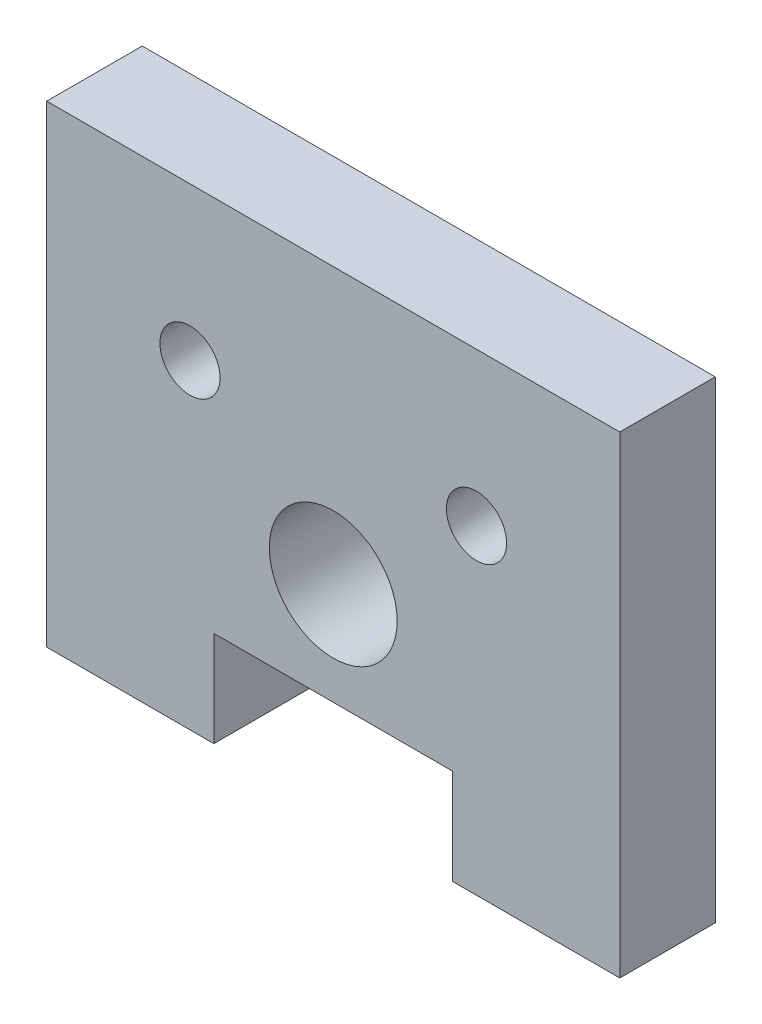
ISO-10303-21;
HEADER;
FILE_DESCRIPTION(('STEP AP214'),'2;1');
FILE_NAME('part.step','',(''),(''),'','','');
FILE_SCHEMA(('AUTOMOTIVE_DESIGN { 1 0 10303 214 1 1 1 1 }'));
ENDSEC;
DATA;
#1=APPLICATION_CONTEXT('core data for automotive mechanical design processes');
#2=APPLICATION_PROTOCOL_DEFINITION('international standard','automotive_design',2000,#1);
#3=PRODUCT_CONTEXT('',#1,'mechanical');
#4=PRODUCT('Part','Part','',(#3));
#5=PRODUCT_RELATED_PRODUCT_CATEGORY('part','',(#4));
#6=PRODUCT_DEFINITION_FORMATION('','',#4);
#7=PRODUCT_DEFINITION_CONTEXT('part definition',#1,'design');
#8=PRODUCT_DEFINITION('design','',#6,#7);
#9=PRODUCT_DEFINITION_SHAPE('','',#8);
#10=(LENGTH_UNIT() NAMED_UNIT(*) SI_UNIT(.MILLI.,.METRE.));
#11=(NAMED_UNIT(*) PLANE_ANGLE_UNIT() SI_UNIT($,.RADIAN.));
#12=(NAMED_UNIT(*) SI_UNIT($,.STERADIAN.) SOLID_ANGLE_UNIT());
#13=UNCERTAINTY_MEASURE_WITH_UNIT(LENGTH_MEASURE(1.E-05),#10,'distance_accuracy_value','');
#14=(GEOMETRIC_REPRESENTATION_CONTEXT(3) GLOBAL_UNCERTAINTY_ASSIGNED_CONTEXT((#13)) GLOBAL_UNIT_ASSIGNED_CONTEXT((#10,
#11,#12)) REPRESENTATION_CONTEXT('',''));
#15=CARTESIAN_POINT('',(0.,0.,0.));
#16=DIRECTION('',(0.,0.,1.));
#17=DIRECTION('',(1.,0.,0.));
#18=AXIS2_PLACEMENT_3D('',#15,#16,#17);
#19=CARTESIAN_POINT('',(-15.875,0.,12.7));
#20=DIRECTION('',(-1.,0.,0.));
#21=DIRECTION('',(0.,0.,1.));
#22=AXIS2_PLACEMENT_3D('',#19,#20,#21);
#23=PLANE('',#22);
#24=DIRECTION('',(0.,1.,0.));
#25=VECTOR('',#24,1.);
#26=CARTESIAN_POINT('',(-15.875,0.,0.));
#27=LINE('',#26,#25);
#28=CARTESIAN_POINT('',(-15.875,-34.544,0.));
#29=VERTEX_POINT('',#28);
#30=CARTESIAN_POINT('',(-15.875,-21.844,0.));
#31=VERTEX_POINT('',#30);
#32=EDGE_CURVE('E139',#29,#31,#27,.T.);
#33=ORIENTED_EDGE('',*,*,#32,.T.);
#34=DIRECTION('',(0.,0.,-1.));
#35=VECTOR('',#34,1.);
#36=CARTESIAN_POINT('',(-15.875,-21.844,12.7));
#37=LINE('',#36,#35);
#38=CARTESIAN_POINT('',(-15.875,-21.844,12.7));
#39=VERTEX_POINT('',#38);
#40=EDGE_CURVE('E11',#39,#31,#37,.T.);
#41=ORIENTED_EDGE('',*,*,#40,.F.);
#42=DIRECTION('',(0.,1.,0.));
#43=VECTOR('',#42,1.);
#44=CARTESIAN_POINT('',(-15.875,0.,12.7));
#45=LINE('',#44,#43);
#46=CARTESIAN_POINT('',(-15.875,-34.544,12.7));
#47=VERTEX_POINT('',#46);
#48=EDGE_CURVE('E184',#47,#39,#45,.T.);
#49=ORIENTED_EDGE('',*,*,#48,.F.);
#50=DIRECTION('',(0.,0.,-1.));
#51=VECTOR('',#50,1.);
#52=CARTESIAN_POINT('',(-15.875,-34.544,12.7));
#53=LINE('',#52,#51);
#54=EDGE_CURVE('E49',#47,#29,#53,.T.);
#55=ORIENTED_EDGE('',*,*,#54,.T.);
#56=EDGE_LOOP('',(#33,#41,#49,#55));
#57=FACE_BOUND('',#56,.T.);
#58=ADVANCED_FACE('F32',(#57),#23,.F.);
#59=CARTESIAN_POINT('',(0.,-21.844,12.7));
#60=DIRECTION('',(0.,1.,0.));
#61=DIRECTION('',(-1.,0.,0.));
#62=AXIS2_PLACEMENT_3D('',#59,#60,#61);
#63=PLANE('',#62);
#64=DIRECTION('',(1.,0.,0.));
#65=VECTOR('',#64,1.);
#66=CARTESIAN_POINT('',(0.,-21.844,0.));
#67=LINE('',#66,#65);
#68=CARTESIAN_POINT('',(15.875,-21.844,0.));
#69=VERTEX_POINT('',#68);
#70=EDGE_CURVE('E141',#31,#69,#67,.T.);
#71=ORIENTED_EDGE('',*,*,#70,.T.);
#72=DIRECTION('',(0.,0.,-1.));
#73=VECTOR('',#72,1.);
#74=CARTESIAN_POINT('',(15.875,-21.844,12.7));
#75=LINE('',#74,#73);
#76=CARTESIAN_POINT('',(15.875,-21.844,12.7));
#77=VERTEX_POINT('',#76);
#78=EDGE_CURVE('E41',#77,#69,#75,.T.);
#79=ORIENTED_EDGE('',*,*,#78,.F.);
#80=DIRECTION('',(1.,0.,0.));
#81=VECTOR('',#80,1.);
#82=CARTESIAN_POINT('',(0.,-21.844,12.7));
#83=LINE('',#82,#81);
#84=EDGE_CURVE('E87',#39,#77,#83,.T.);
#85=ORIENTED_EDGE('',*,*,#84,.F.);
#86=ORIENTED_EDGE('',*,*,#40,.T.);
#87=EDGE_LOOP('',(#71,#79,#85,#86));
#88=FACE_BOUND('',#87,.T.);
#89=ADVANCED_FACE('F220',(#88),#63,.F.);
#90=CARTESIAN_POINT('',(15.875,0.,12.7));
#91=DIRECTION('',(1.,0.,0.));
#92=DIRECTION('',(0.,0.,-1.));
#93=AXIS2_PLACEMENT_3D('',#90,#91,#92);
#94=PLANE('',#93);
#95=DIRECTION('',(0.,-1.,0.));
#96=VECTOR('',#95,1.);
#97=CARTESIAN_POINT('',(15.875,0.,0.));
#98=LINE('',#97,#96);
#99=CARTESIAN_POINT('',(15.875,-34.544,0.));
#100=VERTEX_POINT('',#99);
#101=EDGE_CURVE('E143',#69,#100,#98,.T.);
#102=ORIENTED_EDGE('',*,*,#101,.T.);
#103=DIRECTION('',(0.,0.,-1.));
#104=VECTOR('',#103,1.);
#105=CARTESIAN_POINT('',(15.875,-34.544,12.7));
#106=LINE('',#105,#104);
#107=CARTESIAN_POINT('',(15.875,-34.544,12.7));
#108=VERTEX_POINT('',#107);
#109=EDGE_CURVE('E164',#108,#100,#106,.T.);
#110=ORIENTED_EDGE('',*,*,#109,.F.);
#111=DIRECTION('',(0.,-1.,0.));
#112=VECTOR('',#111,1.);
#113=CARTESIAN_POINT('',(15.875,0.,12.7));
#114=LINE('',#113,#112);
#115=EDGE_CURVE('E171',#77,#108,#114,.T.);
#116=ORIENTED_EDGE('',*,*,#115,.F.);
#117=ORIENTED_EDGE('',*,*,#78,.T.);
#118=EDGE_LOOP('',(#102,#110,#116,#117));
#119=FACE_BOUND('',#118,.T.);
#120=ADVANCED_FACE('F169',(#119),#94,.F.);
#121=CARTESIAN_POINT('',(0.,-34.544,12.7));
#122=DIRECTION('',(0.,-1.,0.));
#123=DIRECTION('',(0.,0.,-1.));
#124=AXIS2_PLACEMENT_3D('',#121,#122,#123);
#125=PLANE('',#124);
#126=DIRECTION('',(-1.,0.,0.));
#127=VECTOR('',#126,1.);
#128=CARTESIAN_POINT('',(0.,-34.544,0.));
#129=LINE('',#128,#127);
#130=CARTESIAN_POINT('',(38.1,-34.544,0.));
#131=VERTEX_POINT('',#130);
#132=EDGE_CURVE('E146',#131,#100,#129,.T.);
#133=ORIENTED_EDGE('',*,*,#132,.F.);
#134=DIRECTION('',(0.,0.,-1.));
#135=VECTOR('',#134,1.);
#136=CARTESIAN_POINT('',(38.1,-34.544,12.7));
#137=LINE('',#136,#135);
#138=CARTESIAN_POINT('',(38.1,-34.544,12.7));
#139=VERTEX_POINT('',#138);
#140=EDGE_CURVE('E162',#139,#131,#137,.T.);
#141=ORIENTED_EDGE('',*,*,#140,.F.);
#142=DIRECTION('',(-1.,0.,0.));
#143=VECTOR('',#142,1.);
#144=CARTESIAN_POINT('',(0.,-34.544,12.7));
#145=LINE('',#144,#143);
#146=EDGE_CURVE('E179',#139,#108,#145,.T.);
#147=ORIENTED_EDGE('',*,*,#146,.T.);
#148=ORIENTED_EDGE('',*,*,#109,.T.);
#149=EDGE_LOOP('',(#133,#141,#147,#148));
#150=FACE_BOUND('',#149,.T.);
#151=ADVANCED_FACE('F177',(#150),#125,.T.);
#152=CARTESIAN_POINT('',(38.1,0.,12.7));
#153=DIRECTION('',(-1.,0.,0.));
#154=DIRECTION('',(0.,0.,1.));
#155=AXIS2_PLACEMENT_3D('',#152,#153,#154);
#156=PLANE('',#155);
#157=DIRECTION('',(0.,1.,0.));
#158=VECTOR('',#157,1.);
#159=CARTESIAN_POINT('',(38.1,0.,0.));
#160=LINE('',#159,#158);
#161=CARTESIAN_POINT('',(38.1,28.3363680824292,0.));
#162=VERTEX_POINT('',#161);
#163=EDGE_CURVE('E149',#131,#162,#160,.T.);
#164=ORIENTED_EDGE('',*,*,#163,.T.);
#165=DIRECTION('',(0.,0.,-1.));
#166=VECTOR('',#165,1.);
#167=CARTESIAN_POINT('',(38.1,28.3363680824292,12.7));
#168=LINE('',#167,#166);
#169=CARTESIAN_POINT('',(38.1,28.3363680824292,12.7));
#170=VERTEX_POINT('',#169);
#171=EDGE_CURVE('E112',#170,#162,#168,.T.);
#172=ORIENTED_EDGE('',*,*,#171,.F.);
#173=DIRECTION('',(0.,1.,0.));
#174=VECTOR('',#173,1.);
#175=CARTESIAN_POINT('',(38.1,0.,12.7));
#176=LINE('',#175,#174);
#177=EDGE_CURVE('E121',#139,#170,#176,.T.);
#178=ORIENTED_EDGE('',*,*,#177,.F.);
#179=ORIENTED_EDGE('',*,*,#140,.T.);
#180=EDGE_LOOP('',(#164,#172,#178,#179));
#181=FACE_BOUND('',#180,.T.);
#182=ADVANCED_FACE('F244',(#181),#156,.F.);
#183=CARTESIAN_POINT('',(0.,28.3363680824292,12.7));
#184=DIRECTION('',(0.,1.,0.));
#185=DIRECTION('',(-1.,0.,0.));
#186=AXIS2_PLACEMENT_3D('',#183,#184,#185);
#187=PLANE('',#186);
#188=DIRECTION('',(1.,0.,0.));
#189=VECTOR('',#188,1.);
#190=CARTESIAN_POINT('',(0.,28.3363680824292,0.));
#191=LINE('',#190,#189);
#192=CARTESIAN_POINT('',(-38.1,28.3363680824292,0.));
#193=VERTEX_POINT('',#192);
#194=EDGE_CURVE('E108',#193,#162,#191,.T.);
#195=ORIENTED_EDGE('',*,*,#194,.F.);
#196=DIRECTION('',(0.,0.,-1.));
#197=VECTOR('',#196,1.);
#198=CARTESIAN_POINT('',(-38.1,28.3363680824292,12.7));
#199=LINE('',#198,#197);
#200=CARTESIAN_POINT('',(-38.1,28.3363680824292,12.7));
#201=VERTEX_POINT('',#200);
#202=EDGE_CURVE('E103',#201,#193,#199,.T.);
#203=ORIENTED_EDGE('',*,*,#202,.F.);
#204=DIRECTION('',(1.,0.,0.));
#205=VECTOR('',#204,1.);
#206=CARTESIAN_POINT('',(0.,28.3363680824292,12.7));
#207=LINE('',#206,#205);
#208=EDGE_CURVE('E106',#201,#170,#207,.T.);
#209=ORIENTED_EDGE('',*,*,#208,.T.);
#210=ORIENTED_EDGE('',*,*,#171,.T.);
#211=EDGE_LOOP('',(#195,#203,#209,#210));
#212=FACE_BOUND('',#211,.T.);
#213=ADVANCED_FACE('F105',(#212),#187,.T.);
#214=CARTESIAN_POINT('',(-38.1,0.,12.7));
#215=DIRECTION('',(-1.,0.,0.));
#216=DIRECTION('',(0.,0.,1.));
#217=AXIS2_PLACEMENT_3D('',#214,#215,#216);
#218=PLANE('',#217);
#219=DIRECTION('',(0.,1.,0.));
#220=VECTOR('',#219,1.);
#221=CARTESIAN_POINT('',(-38.1,0.,0.));
#222=LINE('',#221,#220);
#223=CARTESIAN_POINT('',(-38.1,-34.544,0.));
#224=VERTEX_POINT('',#223);
#225=EDGE_CURVE('E153',#224,#193,#222,.T.);
#226=ORIENTED_EDGE('',*,*,#225,.F.);
#227=DIRECTION('',(0.,0.,-1.));
#228=VECTOR('',#227,1.);
#229=CARTESIAN_POINT('',(-38.1,-34.544,12.7));
#230=LINE('',#229,#228);
#231=CARTESIAN_POINT('',(-38.1,-34.544,12.7));
#232=VERTEX_POINT('',#231);
#233=EDGE_CURVE('E75',#232,#224,#230,.T.);
#234=ORIENTED_EDGE('',*,*,#233,.F.);
#235=DIRECTION('',(0.,1.,0.));
#236=VECTOR('',#235,1.);
#237=CARTESIAN_POINT('',(-38.1,0.,12.7));
#238=LINE('',#237,#236);
#239=EDGE_CURVE('E118',#232,#201,#238,.T.);
#240=ORIENTED_EDGE('',*,*,#239,.T.);
#241=ORIENTED_EDGE('',*,*,#202,.T.);
#242=EDGE_LOOP('',(#226,#234,#240,#241));
#243=FACE_BOUND('',#242,.T.);
#244=ADVANCED_FACE('F124',(#243),#218,.T.);
#245=CARTESIAN_POINT('',(-19.05,7.99200000000001,12.7));
#246=DIRECTION('',(0.,0.,-1.));
#247=DIRECTION('',(-1.,0.,0.));
#248=AXIS2_PLACEMENT_3D('',#245,#246,#247);
#249=CYLINDRICAL_SURFACE('',#248,4.);
#250=CARTESIAN_POINT('',(-19.05,7.99200000000001,12.7));
#251=DIRECTION('',(0.,0.,1.));
#252=DIRECTION('',(1.,0.,0.));
#253=AXIS2_PLACEMENT_3D('',#250,#251,#252);
#254=CIRCLE('',#253,4.);
#255=CARTESIAN_POINT('',(-15.05,7.99200000000001,12.7));
#256=VERTEX_POINT('',#255);
#257=EDGE_CURVE('E186',#256,#256,#254,.T.);
#258=ORIENTED_EDGE('',*,*,#257,.T.);
#259=EDGE_LOOP('',(#258));
#260=FACE_BOUND('',#259,.T.);
#261=CARTESIAN_POINT('',(-19.05,7.99200000000001,0.));
#262=DIRECTION('',(0.,0.,1.));
#263=DIRECTION('',(1.,0.,0.));
#264=AXIS2_PLACEMENT_3D('',#261,#262,#263);
#265=CIRCLE('',#264,4.);
#266=CARTESIAN_POINT('',(-15.05,7.99200000000001,0.));
#267=VERTEX_POINT('',#266);
#268=EDGE_CURVE('E136',#267,#267,#265,.T.);
#269=ORIENTED_EDGE('',*,*,#268,.F.);
#270=EDGE_LOOP('',(#269));
#271=FACE_BOUND('',#270,.T.);
#272=ADVANCED_FACE('F205',(#260,#271),#249,.F.);
#273=CARTESIAN_POINT('',(19.05,7.99200000000001,12.7));
#274=DIRECTION('',(0.,0.,-1.));
#275=DIRECTION('',(-1.,0.,0.));
#276=AXIS2_PLACEMENT_3D('',#273,#274,#275);
#277=CYLINDRICAL_SURFACE('',#276,4.);
#278=CARTESIAN_POINT('',(19.05,7.99200000000001,12.7));
#279=DIRECTION('',(0.,0.,1.));
#280=DIRECTION('',(1.,0.,0.));
#281=AXIS2_PLACEMENT_3D('',#278,#279,#280);
#282=CIRCLE('',#281,4.);
#283=CARTESIAN_POINT('',(23.05,7.99200000000001,12.7));
#284=VERTEX_POINT('',#283);
#285=EDGE_CURVE('E189',#284,#284,#282,.T.);
#286=ORIENTED_EDGE('',*,*,#285,.T.);
#287=EDGE_LOOP('',(#286));
#288=FACE_BOUND('',#287,.T.);
#289=CARTESIAN_POINT('',(19.05,7.99200000000001,0.));
#290=DIRECTION('',(0.,0.,1.));
#291=DIRECTION('',(1.,0.,0.));
#292=AXIS2_PLACEMENT_3D('',#289,#290,#291);
#293=CIRCLE('',#292,4.);
#294=CARTESIAN_POINT('',(23.05,7.99200000000001,0.));
#295=VERTEX_POINT('',#294);
#296=EDGE_CURVE('E133',#295,#295,#293,.T.);
#297=ORIENTED_EDGE('',*,*,#296,.F.);
#298=EDGE_LOOP('',(#297));
#299=FACE_BOUND('',#298,.T.);
#300=ADVANCED_FACE('F208',(#288,#299),#277,.F.);
#301=CARTESIAN_POINT('',(0.,-8.26399999999999,12.7));
#302=DIRECTION('',(0.,0.,-1.));
#303=DIRECTION('',(-1.,0.,0.));
#304=AXIS2_PLACEMENT_3D('',#301,#302,#303);
#305=CYLINDRICAL_SURFACE('',#304,8.5);
#306=CARTESIAN_POINT('',(0.,-8.26399999999999,12.7));
#307=DIRECTION('',(0.,0.,1.));
#308=DIRECTION('',(1.,0.,0.));
#309=AXIS2_PLACEMENT_3D('',#306,#307,#308);
#310=CIRCLE('',#309,8.5);
#311=CARTESIAN_POINT('',(8.5,-8.26399999999999,12.7));
#312=VERTEX_POINT('',#311);
#313=EDGE_CURVE('E158',#312,#312,#310,.T.);
#314=ORIENTED_EDGE('',*,*,#313,.T.);
#315=EDGE_LOOP('',(#314));
#316=FACE_BOUND('',#315,.T.);
#317=CARTESIAN_POINT('',(0.,-8.26399999999999,0.));
#318=DIRECTION('',(0.,0.,1.));
#319=DIRECTION('',(1.,0.,0.));
#320=AXIS2_PLACEMENT_3D('',#317,#318,#319);
#321=CIRCLE('',#320,8.5);
#322=CARTESIAN_POINT('',(8.5,-8.26399999999999,0.));
#323=VERTEX_POINT('',#322);
#324=EDGE_CURVE('E130',#323,#323,#321,.T.);
#325=ORIENTED_EDGE('',*,*,#324,.F.);
#326=EDGE_LOOP('',(#325));
#327=FACE_BOUND('',#326,.T.);
#328=ADVANCED_FACE('F34',(#316,#327),#305,.F.);
#329=CARTESIAN_POINT('',(0.,-34.544,12.7));
#330=DIRECTION('',(0.,-1.,0.));
#331=DIRECTION('',(0.,0.,-1.));
#332=AXIS2_PLACEMENT_3D('',#329,#330,#331);
#333=PLANE('',#332);
#334=DIRECTION('',(-1.,0.,0.));
#335=VECTOR('',#334,1.);
#336=CARTESIAN_POINT('',(0.,-34.544,0.));
#337=LINE('',#336,#335);
#338=EDGE_CURVE('E155',#29,#224,#337,.T.);
#339=ORIENTED_EDGE('',*,*,#338,.F.);
#340=ORIENTED_EDGE('',*,*,#54,.F.);
#341=DIRECTION('',(-1.,0.,0.));
#342=VECTOR('',#341,1.);
#343=CARTESIAN_POINT('',(0.,-34.544,12.7));
#344=LINE('',#343,#342);
#345=EDGE_CURVE('E125',#47,#232,#344,.T.);
#346=ORIENTED_EDGE('',*,*,#345,.T.);
#347=ORIENTED_EDGE('',*,*,#233,.T.);
#348=EDGE_LOOP('',(#339,#340,#346,#347));
#349=FACE_BOUND('',#348,.T.);
#350=ADVANCED_FACE('F199',(#349),#333,.T.);
#351=CARTESIAN_POINT('',(0.,0.,12.7));
#352=DIRECTION('',(0.,0.,1.));
#353=DIRECTION('',(1.,0.,0.));
#354=AXIS2_PLACEMENT_3D('',#351,#352,#353);
#355=PLANE('',#354);
#356=ORIENTED_EDGE('',*,*,#313,.F.);
#357=EDGE_LOOP('',(#356));
#358=FACE_BOUND('',#357,.T.);
#359=ORIENTED_EDGE('',*,*,#285,.F.);
#360=EDGE_LOOP('',(#359));
#361=FACE_BOUND('',#360,.T.);
#362=ORIENTED_EDGE('',*,*,#257,.F.);
#363=EDGE_LOOP('',(#362));
#364=FACE_BOUND('',#363,.T.);
#365=ORIENTED_EDGE('',*,*,#48,.T.);
#366=ORIENTED_EDGE('',*,*,#84,.T.);
#367=ORIENTED_EDGE('',*,*,#115,.T.);
#368=ORIENTED_EDGE('',*,*,#146,.F.);
#369=ORIENTED_EDGE('',*,*,#177,.T.);
#370=ORIENTED_EDGE('',*,*,#208,.F.);
#371=ORIENTED_EDGE('',*,*,#239,.F.);
#372=ORIENTED_EDGE('',*,*,#345,.F.);
#373=EDGE_LOOP('',(#365,#366,#367,#368,#369,#370,#371,#372));
#374=FACE_BOUND('',#373,.T.);
#375=ADVANCED_FACE('F116',(#358,#361,#364,#374),#355,.T.);
#376=CARTESIAN_POINT('',(0.,0.,0.));
#377=DIRECTION('',(0.,0.,1.));
#378=DIRECTION('',(1.,0.,0.));
#379=AXIS2_PLACEMENT_3D('',#376,#377,#378);
#380=PLANE('',#379);
#381=ORIENTED_EDGE('',*,*,#324,.T.);
#382=EDGE_LOOP('',(#381));
#383=FACE_BOUND('',#382,.T.);
#384=ORIENTED_EDGE('',*,*,#296,.T.);
#385=EDGE_LOOP('',(#384));
#386=FACE_BOUND('',#385,.T.);
#387=ORIENTED_EDGE('',*,*,#268,.T.);
#388=EDGE_LOOP('',(#387));
#389=FACE_BOUND('',#388,.T.);
#390=ORIENTED_EDGE('',*,*,#32,.F.);
#391=ORIENTED_EDGE('',*,*,#338,.T.);
#392=ORIENTED_EDGE('',*,*,#225,.T.);
#393=ORIENTED_EDGE('',*,*,#194,.T.);
#394=ORIENTED_EDGE('',*,*,#163,.F.);
#395=ORIENTED_EDGE('',*,*,#132,.T.);
#396=ORIENTED_EDGE('',*,*,#101,.F.);
#397=ORIENTED_EDGE('',*,*,#70,.F.);
#398=EDGE_LOOP('',(#390,#391,#392,#393,#394,#395,#396,#397));
#399=FACE_BOUND('',#398,.T.);
#400=ADVANCED_FACE('F173',(#383,#386,#389,#399),#380,.F.);
#401=CLOSED_SHELL('',(#58,#89,#120,#151,#182,#213,#244,#272,#300,#328,#350,#375,#400));
#402=MANIFOLD_SOLID_BREP('B2',#401);
#403=ADVANCED_BREP_SHAPE_REPRESENTATION('',(#18,#402),#14);
#404=SHAPE_DEFINITION_REPRESENTATION(#9,#403);
ENDSEC;
END-ISO-10303-21;
